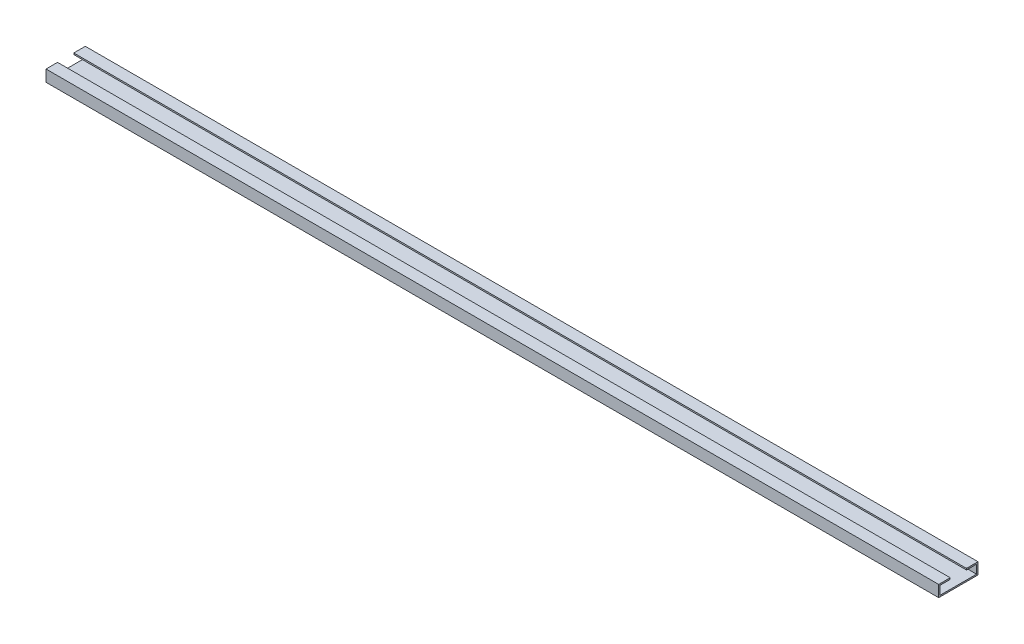
ISO-10303-21;
HEADER;
FILE_DESCRIPTION(('STEP AP214'),'2;1');
FILE_NAME('part.step','',(''),(''),'','','');
FILE_SCHEMA(('AUTOMOTIVE_DESIGN { 1 0 10303 214 1 1 1 1 }'));
ENDSEC;
DATA;
#1=APPLICATION_CONTEXT('core data for automotive mechanical design processes');
#2=APPLICATION_PROTOCOL_DEFINITION('international standard','automotive_design',2000,#1);
#3=PRODUCT_CONTEXT('',#1,'mechanical');
#4=PRODUCT('Part','Part','',(#3));
#5=PRODUCT_RELATED_PRODUCT_CATEGORY('part','',(#4));
#6=PRODUCT_DEFINITION_FORMATION('','',#4);
#7=PRODUCT_DEFINITION_CONTEXT('part definition',#1,'design');
#8=PRODUCT_DEFINITION('design','',#6,#7);
#9=PRODUCT_DEFINITION_SHAPE('','',#8);
#10=(LENGTH_UNIT() NAMED_UNIT(*) SI_UNIT(.MILLI.,.METRE.));
#11=(NAMED_UNIT(*) PLANE_ANGLE_UNIT() SI_UNIT($,.RADIAN.));
#12=(NAMED_UNIT(*) SI_UNIT($,.STERADIAN.) SOLID_ANGLE_UNIT());
#13=UNCERTAINTY_MEASURE_WITH_UNIT(LENGTH_MEASURE(1.E-05),#10,'distance_accuracy_value','');
#14=(GEOMETRIC_REPRESENTATION_CONTEXT(3) GLOBAL_UNCERTAINTY_ASSIGNED_CONTEXT((#13)) GLOBAL_UNIT_ASSIGNED_CONTEXT((#10,
#11,#12)) REPRESENTATION_CONTEXT('',''));
#15=CARTESIAN_POINT('',(0.,0.,0.));
#16=DIRECTION('',(0.,0.,1.));
#17=DIRECTION('',(1.,0.,0.));
#18=AXIS2_PLACEMENT_3D('',#15,#16,#17);
#19=CARTESIAN_POINT('',(310.,0.,-13.65));
#20=DIRECTION('',(0.,-1.,0.));
#21=DIRECTION('',(0.,0.,-1.));
#22=AXIS2_PLACEMENT_3D('',#19,#20,#21);
#23=PLANE('',#22);
#24=DIRECTION('',(0.,0.,1.));
#25=VECTOR('',#24,1.);
#26=CARTESIAN_POINT('',(0.,0.,-13.65));
#27=LINE('',#26,#25);
#28=CARTESIAN_POINT('',(0.,0.,-13.65));
#29=VERTEX_POINT('',#28);
#30=CARTESIAN_POINT('',(0.,0.,0.));
#31=VERTEX_POINT('',#30);
#32=EDGE_CURVE('E154',#29,#31,#27,.T.);
#33=ORIENTED_EDGE('',*,*,#32,.F.);
#34=DIRECTION('',(-1.,0.,0.));
#35=VECTOR('',#34,1.);
#36=CARTESIAN_POINT('',(310.,0.,-13.65));
#37=LINE('',#36,#35);
#38=CARTESIAN_POINT('',(310.,0.,-13.65));
#39=VERTEX_POINT('',#38);
#40=EDGE_CURVE('E11',#39,#29,#37,.T.);
#41=ORIENTED_EDGE('',*,*,#40,.F.);
#42=DIRECTION('',(0.,0.,1.));
#43=VECTOR('',#42,1.);
#44=CARTESIAN_POINT('',(310.,0.,-13.65));
#45=LINE('',#44,#43);
#46=CARTESIAN_POINT('',(310.,0.,0.));
#47=VERTEX_POINT('',#46);
#48=EDGE_CURVE('E186',#39,#47,#45,.T.);
#49=ORIENTED_EDGE('',*,*,#48,.T.);
#50=DIRECTION('',(-1.,0.,0.));
#51=VECTOR('',#50,1.);
#52=CARTESIAN_POINT('',(310.,0.,0.));
#53=LINE('',#52,#51);
#54=EDGE_CURVE('E36',#47,#31,#53,.T.);
#55=ORIENTED_EDGE('',*,*,#54,.T.);
#56=EDGE_LOOP('',(#33,#41,#49,#55));
#57=FACE_BOUND('',#56,.T.);
#58=ADVANCED_FACE('F33',(#57),#23,.T.);
#59=CARTESIAN_POINT('',(310.,4.,-13.65));
#60=DIRECTION('',(0.,0.,-1.));
#61=DIRECTION('',(-1.,0.,0.));
#62=AXIS2_PLACEMENT_3D('',#59,#60,#61);
#63=PLANE('',#62);
#64=DIRECTION('',(0.,-1.,0.));
#65=VECTOR('',#64,1.);
#66=CARTESIAN_POINT('',(0.,4.,-13.65));
#67=LINE('',#66,#65);
#68=CARTESIAN_POINT('',(0.,4.,-13.65));
#69=VERTEX_POINT('',#68);
#70=EDGE_CURVE('E184',#69,#29,#67,.T.);
#71=ORIENTED_EDGE('',*,*,#70,.F.);
#72=DIRECTION('',(-1.,0.,0.));
#73=VECTOR('',#72,1.);
#74=CARTESIAN_POINT('',(310.,4.,-13.65));
#75=LINE('',#74,#73);
#76=CARTESIAN_POINT('',(310.,4.,-13.65));
#77=VERTEX_POINT('',#76);
#78=EDGE_CURVE('E42',#77,#69,#75,.T.);
#79=ORIENTED_EDGE('',*,*,#78,.F.);
#80=DIRECTION('',(0.,-1.,0.));
#81=VECTOR('',#80,1.);
#82=CARTESIAN_POINT('',(310.,4.,-13.65));
#83=LINE('',#82,#81);
#84=EDGE_CURVE('E144',#77,#39,#83,.T.);
#85=ORIENTED_EDGE('',*,*,#84,.T.);
#86=ORIENTED_EDGE('',*,*,#40,.T.);
#87=EDGE_LOOP('',(#71,#79,#85,#86));
#88=FACE_BOUND('',#87,.T.);
#89=ADVANCED_FACE('F206',(#88),#63,.T.);
#90=CARTESIAN_POINT('',(310.,4.,-9.65));
#91=DIRECTION('',(0.,1.,0.));
#92=DIRECTION('',(0.,0.,1.));
#93=AXIS2_PLACEMENT_3D('',#90,#91,#92);
#94=PLANE('',#93);
#95=DIRECTION('',(0.,0.,-1.));
#96=VECTOR('',#95,1.);
#97=CARTESIAN_POINT('',(0.,4.,-9.65));
#98=LINE('',#97,#96);
#99=CARTESIAN_POINT('',(0.,4.,-9.65));
#100=VERTEX_POINT('',#99);
#101=EDGE_CURVE('E131',#100,#69,#98,.T.);
#102=ORIENTED_EDGE('',*,*,#101,.F.);
#103=DIRECTION('',(-1.,0.,0.));
#104=VECTOR('',#103,1.);
#105=CARTESIAN_POINT('',(310.,4.,-9.65));
#106=LINE('',#105,#104);
#107=CARTESIAN_POINT('',(310.,4.,-9.65));
#108=VERTEX_POINT('',#107);
#109=EDGE_CURVE('E126',#108,#100,#106,.T.);
#110=ORIENTED_EDGE('',*,*,#109,.F.);
#111=DIRECTION('',(0.,0.,-1.));
#112=VECTOR('',#111,1.);
#113=CARTESIAN_POINT('',(310.,4.,-9.65));
#114=LINE('',#113,#112);
#115=EDGE_CURVE('E129',#108,#77,#114,.T.);
#116=ORIENTED_EDGE('',*,*,#115,.T.);
#117=ORIENTED_EDGE('',*,*,#78,.T.);
#118=EDGE_LOOP('',(#102,#110,#116,#117));
#119=FACE_BOUND('',#118,.T.);
#120=ADVANCED_FACE('F128',(#119),#94,.T.);
#121=CARTESIAN_POINT('',(310.,3.5,-9.65));
#122=DIRECTION('',(0.,0.,1.));
#123=DIRECTION('',(1.,0.,0.));
#124=AXIS2_PLACEMENT_3D('',#121,#122,#123);
#125=PLANE('',#124);
#126=DIRECTION('',(0.,1.,0.));
#127=VECTOR('',#126,1.);
#128=CARTESIAN_POINT('',(0.,3.5,-9.65));
#129=LINE('',#128,#127);
#130=CARTESIAN_POINT('',(0.,3.5,-9.65));
#131=VERTEX_POINT('',#130);
#132=EDGE_CURVE('E181',#131,#100,#129,.T.);
#133=ORIENTED_EDGE('',*,*,#132,.F.);
#134=DIRECTION('',(-1.,0.,0.));
#135=VECTOR('',#134,1.);
#136=CARTESIAN_POINT('',(310.,3.5,-9.65));
#137=LINE('',#136,#135);
#138=CARTESIAN_POINT('',(310.,3.5,-9.65));
#139=VERTEX_POINT('',#138);
#140=EDGE_CURVE('E136',#139,#131,#137,.T.);
#141=ORIENTED_EDGE('',*,*,#140,.F.);
#142=DIRECTION('',(0.,1.,0.));
#143=VECTOR('',#142,1.);
#144=CARTESIAN_POINT('',(310.,3.5,-9.65));
#145=LINE('',#144,#143);
#146=EDGE_CURVE('E142',#139,#108,#145,.T.);
#147=ORIENTED_EDGE('',*,*,#146,.T.);
#148=ORIENTED_EDGE('',*,*,#109,.T.);
#149=EDGE_LOOP('',(#133,#141,#147,#148));
#150=FACE_BOUND('',#149,.T.);
#151=ADVANCED_FACE('F146',(#150),#125,.T.);
#152=CARTESIAN_POINT('',(310.,3.5,-13.15));
#153=DIRECTION('',(0.,-1.,0.));
#154=DIRECTION('',(0.,0.,-1.));
#155=AXIS2_PLACEMENT_3D('',#152,#153,#154);
#156=PLANE('',#155);
#157=DIRECTION('',(0.,0.,1.));
#158=VECTOR('',#157,1.);
#159=CARTESIAN_POINT('',(0.,3.5,-13.15));
#160=LINE('',#159,#158);
#161=CARTESIAN_POINT('',(0.,3.5,-13.15));
#162=VERTEX_POINT('',#161);
#163=EDGE_CURVE('E178',#162,#131,#160,.T.);
#164=ORIENTED_EDGE('',*,*,#163,.F.);
#165=DIRECTION('',(-1.,0.,0.));
#166=VECTOR('',#165,1.);
#167=CARTESIAN_POINT('',(310.,3.5,-13.15));
#168=LINE('',#167,#166);
#169=CARTESIAN_POINT('',(310.,3.5,-13.15));
#170=VERTEX_POINT('',#169);
#171=EDGE_CURVE('E190',#170,#162,#168,.T.);
#172=ORIENTED_EDGE('',*,*,#171,.F.);
#173=DIRECTION('',(0.,0.,1.));
#174=VECTOR('',#173,1.);
#175=CARTESIAN_POINT('',(310.,3.5,-13.15));
#176=LINE('',#175,#174);
#177=EDGE_CURVE('E147',#170,#139,#176,.T.);
#178=ORIENTED_EDGE('',*,*,#177,.T.);
#179=ORIENTED_EDGE('',*,*,#140,.T.);
#180=EDGE_LOOP('',(#164,#172,#178,#179));
#181=FACE_BOUND('',#180,.T.);
#182=ADVANCED_FACE('F219',(#181),#156,.T.);
#183=CARTESIAN_POINT('',(310.,0.5,-13.15));
#184=DIRECTION('',(0.,0.,1.));
#185=DIRECTION('',(1.,0.,0.));
#186=AXIS2_PLACEMENT_3D('',#183,#184,#185);
#187=PLANE('',#186);
#188=DIRECTION('',(0.,1.,0.));
#189=VECTOR('',#188,1.);
#190=CARTESIAN_POINT('',(0.,0.5,-13.15));
#191=LINE('',#190,#189);
#192=CARTESIAN_POINT('',(0.,0.5,-13.15));
#193=VERTEX_POINT('',#192);
#194=EDGE_CURVE('E175',#193,#162,#191,.T.);
#195=ORIENTED_EDGE('',*,*,#194,.F.);
#196=DIRECTION('',(-1.,0.,0.));
#197=VECTOR('',#196,1.);
#198=CARTESIAN_POINT('',(310.,0.5,-13.15));
#199=LINE('',#198,#197);
#200=CARTESIAN_POINT('',(310.,0.5,-13.15));
#201=VERTEX_POINT('',#200);
#202=EDGE_CURVE('E192',#201,#193,#199,.T.);
#203=ORIENTED_EDGE('',*,*,#202,.F.);
#204=DIRECTION('',(0.,1.,0.));
#205=VECTOR('',#204,1.);
#206=CARTESIAN_POINT('',(310.,0.5,-13.15));
#207=LINE('',#206,#205);
#208=EDGE_CURVE('E149',#201,#170,#207,.T.);
#209=ORIENTED_EDGE('',*,*,#208,.T.);
#210=ORIENTED_EDGE('',*,*,#171,.T.);
#211=EDGE_LOOP('',(#195,#203,#209,#210));
#212=FACE_BOUND('',#211,.T.);
#213=ADVANCED_FACE('F222',(#212),#187,.T.);
#214=CARTESIAN_POINT('',(310.,0.5,-0.5));
#215=DIRECTION('',(0.,1.,0.));
#216=DIRECTION('',(0.,0.,1.));
#217=AXIS2_PLACEMENT_3D('',#214,#215,#216);
#218=PLANE('',#217);
#219=DIRECTION('',(0.,0.,-1.));
#220=VECTOR('',#219,1.);
#221=CARTESIAN_POINT('',(0.,0.5,-0.5));
#222=LINE('',#221,#220);
#223=CARTESIAN_POINT('',(0.,0.5,-0.5));
#224=VERTEX_POINT('',#223);
#225=EDGE_CURVE('E172',#224,#193,#222,.T.);
#226=ORIENTED_EDGE('',*,*,#225,.F.);
#227=DIRECTION('',(-1.,0.,0.));
#228=VECTOR('',#227,1.);
#229=CARTESIAN_POINT('',(310.,0.5,-0.5));
#230=LINE('',#229,#228);
#231=CARTESIAN_POINT('',(310.,0.5,-0.5));
#232=VERTEX_POINT('',#231);
#233=EDGE_CURVE('E194',#232,#224,#230,.T.);
#234=ORIENTED_EDGE('',*,*,#233,.F.);
#235=DIRECTION('',(0.,0.,-1.));
#236=VECTOR('',#235,1.);
#237=CARTESIAN_POINT('',(310.,0.5,-0.5));
#238=LINE('',#237,#236);
#239=EDGE_CURVE('E348',#232,#201,#238,.T.);
#240=ORIENTED_EDGE('',*,*,#239,.T.);
#241=ORIENTED_EDGE('',*,*,#202,.T.);
#242=EDGE_LOOP('',(#226,#234,#240,#241));
#243=FACE_BOUND('',#242,.T.);
#244=ADVANCED_FACE('F226',(#243),#218,.T.);
#245=CARTESIAN_POINT('',(310.,3.5,-0.5));
#246=DIRECTION('',(0.,0.,-1.));
#247=DIRECTION('',(0.,1.,0.));
#248=AXIS2_PLACEMENT_3D('',#245,#246,#247);
#249=PLANE('',#248);
#250=DIRECTION('',(0.,-1.,0.));
#251=VECTOR('',#250,1.);
#252=CARTESIAN_POINT('',(0.,3.5,-0.5));
#253=LINE('',#252,#251);
#254=CARTESIAN_POINT('',(0.,3.5,-0.5));
#255=VERTEX_POINT('',#254);
#256=EDGE_CURVE('E169',#255,#224,#253,.T.);
#257=ORIENTED_EDGE('',*,*,#256,.F.);
#258=DIRECTION('',(-1.,0.,0.));
#259=VECTOR('',#258,1.);
#260=CARTESIAN_POINT('',(310.,3.5,-0.5));
#261=LINE('',#260,#259);
#262=CARTESIAN_POINT('',(310.,3.5,-0.5));
#263=VERTEX_POINT('',#262);
#264=EDGE_CURVE('E196',#263,#255,#261,.T.);
#265=ORIENTED_EDGE('',*,*,#264,.F.);
#266=DIRECTION('',(0.,-1.,0.));
#267=VECTOR('',#266,1.);
#268=CARTESIAN_POINT('',(310.,3.5,-0.5));
#269=LINE('',#268,#267);
#270=EDGE_CURVE('E352',#263,#232,#269,.T.);
#271=ORIENTED_EDGE('',*,*,#270,.T.);
#272=ORIENTED_EDGE('',*,*,#233,.T.);
#273=EDGE_LOOP('',(#257,#265,#271,#272));
#274=FACE_BOUND('',#273,.T.);
#275=ADVANCED_FACE('F230',(#274),#249,.T.);
#276=CARTESIAN_POINT('',(310.,3.5,-4.));
#277=DIRECTION('',(0.,-1.,0.));
#278=DIRECTION('',(0.,0.,-1.));
#279=AXIS2_PLACEMENT_3D('',#276,#277,#278);
#280=PLANE('',#279);
#281=DIRECTION('',(0.,0.,1.));
#282=VECTOR('',#281,1.);
#283=CARTESIAN_POINT('',(0.,3.5,-4.));
#284=LINE('',#283,#282);
#285=CARTESIAN_POINT('',(0.,3.5,-4.));
#286=VERTEX_POINT('',#285);
#287=EDGE_CURVE('E166',#286,#255,#284,.T.);
#288=ORIENTED_EDGE('',*,*,#287,.F.);
#289=DIRECTION('',(-1.,0.,0.));
#290=VECTOR('',#289,1.);
#291=CARTESIAN_POINT('',(310.,3.5,-4.));
#292=LINE('',#291,#290);
#293=CARTESIAN_POINT('',(310.,3.5,-4.));
#294=VERTEX_POINT('',#293);
#295=EDGE_CURVE('E198',#294,#286,#292,.T.);
#296=ORIENTED_EDGE('',*,*,#295,.F.);
#297=DIRECTION('',(0.,0.,1.));
#298=VECTOR('',#297,1.);
#299=CARTESIAN_POINT('',(310.,3.5,-4.));
#300=LINE('',#299,#298);
#301=EDGE_CURVE('E341',#294,#263,#300,.T.);
#302=ORIENTED_EDGE('',*,*,#301,.T.);
#303=ORIENTED_EDGE('',*,*,#264,.T.);
#304=EDGE_LOOP('',(#288,#296,#302,#303));
#305=FACE_BOUND('',#304,.T.);
#306=ADVANCED_FACE('F234',(#305),#280,.T.);
#307=CARTESIAN_POINT('',(310.,4.,-4.));
#308=DIRECTION('',(0.,0.,-1.));
#309=DIRECTION('',(-1.,0.,0.));
#310=AXIS2_PLACEMENT_3D('',#307,#308,#309);
#311=PLANE('',#310);
#312=DIRECTION('',(0.,-1.,0.));
#313=VECTOR('',#312,1.);
#314=CARTESIAN_POINT('',(0.,4.,-4.));
#315=LINE('',#314,#313);
#316=CARTESIAN_POINT('',(0.,4.,-4.));
#317=VERTEX_POINT('',#316);
#318=EDGE_CURVE('E163',#317,#286,#315,.T.);
#319=ORIENTED_EDGE('',*,*,#318,.F.);
#320=DIRECTION('',(-1.,0.,0.));
#321=VECTOR('',#320,1.);
#322=CARTESIAN_POINT('',(310.,4.,-4.));
#323=LINE('',#322,#321);
#324=CARTESIAN_POINT('',(310.,4.,-4.));
#325=VERTEX_POINT('',#324);
#326=EDGE_CURVE('E200',#325,#317,#323,.T.);
#327=ORIENTED_EDGE('',*,*,#326,.F.);
#328=DIRECTION('',(0.,-1.,0.));
#329=VECTOR('',#328,1.);
#330=CARTESIAN_POINT('',(310.,4.,-4.));
#331=LINE('',#330,#329);
#332=EDGE_CURVE('E337',#325,#294,#331,.T.);
#333=ORIENTED_EDGE('',*,*,#332,.T.);
#334=ORIENTED_EDGE('',*,*,#295,.T.);
#335=EDGE_LOOP('',(#319,#327,#333,#334));
#336=FACE_BOUND('',#335,.T.);
#337=ADVANCED_FACE('F238',(#336),#311,.T.);
#338=CARTESIAN_POINT('',(310.,4.,0.));
#339=DIRECTION('',(0.,1.,0.));
#340=DIRECTION('',(0.,0.,1.));
#341=AXIS2_PLACEMENT_3D('',#338,#339,#340);
#342=PLANE('',#341);
#343=DIRECTION('',(0.,0.,-1.));
#344=VECTOR('',#343,1.);
#345=CARTESIAN_POINT('',(0.,4.,0.));
#346=LINE('',#345,#344);
#347=CARTESIAN_POINT('',(0.,4.,0.));
#348=VERTEX_POINT('',#347);
#349=EDGE_CURVE('E160',#348,#317,#346,.T.);
#350=ORIENTED_EDGE('',*,*,#349,.F.);
#351=DIRECTION('',(-1.,0.,0.));
#352=VECTOR('',#351,1.);
#353=CARTESIAN_POINT('',(310.,4.,0.));
#354=LINE('',#353,#352);
#355=CARTESIAN_POINT('',(310.,4.,0.));
#356=VERTEX_POINT('',#355);
#357=EDGE_CURVE('E201',#356,#348,#354,.T.);
#358=ORIENTED_EDGE('',*,*,#357,.F.);
#359=DIRECTION('',(0.,0.,-1.));
#360=VECTOR('',#359,1.);
#361=CARTESIAN_POINT('',(310.,4.,0.));
#362=LINE('',#361,#360);
#363=EDGE_CURVE('E358',#356,#325,#362,.T.);
#364=ORIENTED_EDGE('',*,*,#363,.T.);
#365=ORIENTED_EDGE('',*,*,#326,.T.);
#366=EDGE_LOOP('',(#350,#358,#364,#365));
#367=FACE_BOUND('',#366,.T.);
#368=ADVANCED_FACE('F242',(#367),#342,.T.);
#369=CARTESIAN_POINT('',(310.,0.,0.));
#370=DIRECTION('',(0.,0.,1.));
#371=DIRECTION('',(1.,0.,0.));
#372=AXIS2_PLACEMENT_3D('',#369,#370,#371);
#373=PLANE('',#372);
#374=DIRECTION('',(0.,1.,0.));
#375=VECTOR('',#374,1.);
#376=CARTESIAN_POINT('',(0.,0.,0.));
#377=LINE('',#376,#375);
#378=EDGE_CURVE('E157',#31,#348,#377,.T.);
#379=ORIENTED_EDGE('',*,*,#378,.F.);
#380=ORIENTED_EDGE('',*,*,#54,.F.);
#381=DIRECTION('',(0.,1.,0.));
#382=VECTOR('',#381,1.);
#383=CARTESIAN_POINT('',(310.,0.,0.));
#384=LINE('',#383,#382);
#385=EDGE_CURVE('E360',#47,#356,#384,.T.);
#386=ORIENTED_EDGE('',*,*,#385,.T.);
#387=ORIENTED_EDGE('',*,*,#357,.T.);
#388=EDGE_LOOP('',(#379,#380,#386,#387));
#389=FACE_BOUND('',#388,.T.);
#390=ADVANCED_FACE('F203',(#389),#373,.T.);
#391=CARTESIAN_POINT('',(310.,0.,0.));
#392=DIRECTION('',(-1.,0.,0.));
#393=DIRECTION('',(0.,0.,1.));
#394=AXIS2_PLACEMENT_3D('',#391,#392,#393);
#395=PLANE('',#394);
#396=ORIENTED_EDGE('',*,*,#48,.F.);
#397=ORIENTED_EDGE('',*,*,#84,.F.);
#398=ORIENTED_EDGE('',*,*,#115,.F.);
#399=ORIENTED_EDGE('',*,*,#146,.F.);
#400=ORIENTED_EDGE('',*,*,#177,.F.);
#401=ORIENTED_EDGE('',*,*,#208,.F.);
#402=ORIENTED_EDGE('',*,*,#239,.F.);
#403=ORIENTED_EDGE('',*,*,#270,.F.);
#404=ORIENTED_EDGE('',*,*,#301,.F.);
#405=ORIENTED_EDGE('',*,*,#332,.F.);
#406=ORIENTED_EDGE('',*,*,#363,.F.);
#407=ORIENTED_EDGE('',*,*,#385,.F.);
#408=EDGE_LOOP('',(#396,#397,#398,#399,#400,#401,#402,#403,#404,#405,#406,#407));
#409=FACE_BOUND('',#408,.T.);
#410=ADVANCED_FACE('F140',(#409),#395,.F.);
#411=CARTESIAN_POINT('',(0.,0.,0.));
#412=DIRECTION('',(-1.,0.,0.));
#413=DIRECTION('',(0.,0.,1.));
#414=AXIS2_PLACEMENT_3D('',#411,#412,#413);
#415=PLANE('',#414);
#416=ORIENTED_EDGE('',*,*,#32,.T.);
#417=ORIENTED_EDGE('',*,*,#378,.T.);
#418=ORIENTED_EDGE('',*,*,#349,.T.);
#419=ORIENTED_EDGE('',*,*,#318,.T.);
#420=ORIENTED_EDGE('',*,*,#287,.T.);
#421=ORIENTED_EDGE('',*,*,#256,.T.);
#422=ORIENTED_EDGE('',*,*,#225,.T.);
#423=ORIENTED_EDGE('',*,*,#194,.T.);
#424=ORIENTED_EDGE('',*,*,#163,.T.);
#425=ORIENTED_EDGE('',*,*,#132,.T.);
#426=ORIENTED_EDGE('',*,*,#101,.T.);
#427=ORIENTED_EDGE('',*,*,#70,.T.);
#428=EDGE_LOOP('',(#416,#417,#418,#419,#420,#421,#422,#423,#424,#425,#426,#427));
#429=FACE_BOUND('',#428,.T.);
#430=ADVANCED_FACE('F205',(#429),#415,.T.);
#431=CLOSED_SHELL('',(#58,#89,#120,#151,#182,#213,#244,#275,#306,#337,#368,#390,#410,#430));
#432=MANIFOLD_SOLID_BREP('B2',#431);
#433=ADVANCED_BREP_SHAPE_REPRESENTATION('',(#18,#432),#14);
#434=SHAPE_DEFINITION_REPRESENTATION(#9,#433);
ENDSEC;
END-ISO-10303-21;
